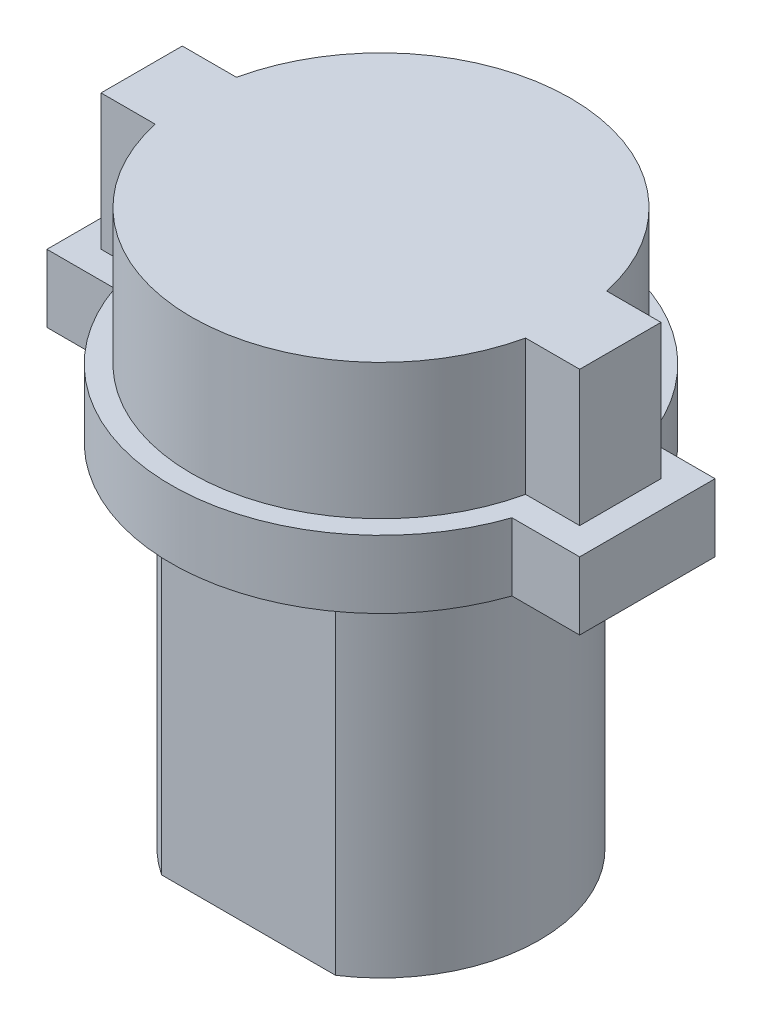
ISO-10303-21;
HEADER;
FILE_DESCRIPTION(('STEP AP214'),'2;1');
FILE_NAME('part.step','',(''),(''),'','','');
FILE_SCHEMA(('AUTOMOTIVE_DESIGN { 1 0 10303 214 1 1 1 1 }'));
ENDSEC;
DATA;
#1=APPLICATION_CONTEXT('core data for automotive mechanical design processes');
#2=APPLICATION_PROTOCOL_DEFINITION('international standard','automotive_design',2000,#1);
#3=PRODUCT_CONTEXT('',#1,'mechanical');
#4=PRODUCT('Part','Part','',(#3));
#5=PRODUCT_RELATED_PRODUCT_CATEGORY('part','',(#4));
#6=PRODUCT_DEFINITION_FORMATION('','',#4);
#7=PRODUCT_DEFINITION_CONTEXT('part definition',#1,'design');
#8=PRODUCT_DEFINITION('design','',#6,#7);
#9=PRODUCT_DEFINITION_SHAPE('','',#8);
#10=(LENGTH_UNIT() NAMED_UNIT(*) SI_UNIT(.MILLI.,.METRE.));
#11=(NAMED_UNIT(*) PLANE_ANGLE_UNIT() SI_UNIT($,.RADIAN.));
#12=(NAMED_UNIT(*) SI_UNIT($,.STERADIAN.) SOLID_ANGLE_UNIT());
#13=UNCERTAINTY_MEASURE_WITH_UNIT(LENGTH_MEASURE(1.E-05),#10,'distance_accuracy_value','');
#14=(GEOMETRIC_REPRESENTATION_CONTEXT(3) GLOBAL_UNCERTAINTY_ASSIGNED_CONTEXT((#13)) GLOBAL_UNIT_ASSIGNED_CONTEXT((#10,
#11,#12)) REPRESENTATION_CONTEXT('',''));
#15=CARTESIAN_POINT('',(0.,0.,0.));
#16=DIRECTION('',(0.,0.,1.));
#17=DIRECTION('',(1.,0.,0.));
#18=AXIS2_PLACEMENT_3D('',#15,#16,#17);
#19=CARTESIAN_POINT('',(0.,13.,0.));
#20=DIRECTION('',(0.,-1.,0.));
#21=DIRECTION('',(0.,0.,-1.));
#22=AXIS2_PLACEMENT_3D('',#19,#20,#21);
#23=CYLINDRICAL_SURFACE('',#22,5.85);
#24=CARTESIAN_POINT('',(0.,0.,0.));
#25=DIRECTION('',(0.,1.,0.));
#26=DIRECTION('',(0.,0.,1.));
#27=AXIS2_PLACEMENT_3D('',#24,#25,#26);
#28=CIRCLE('',#27,5.85);
#29=CARTESIAN_POINT('',(-3.21098115846232,0.,-4.89));
#30=VERTEX_POINT('',#29);
#31=CARTESIAN_POINT('',(-3.21098115846232,0.,4.89));
#32=VERTEX_POINT('',#31);
#33=EDGE_CURVE('E298',#30,#32,#28,.T.);
#34=ORIENTED_EDGE('',*,*,#33,.T.);
#35=DIRECTION('',(0.,-1.,0.));
#36=VECTOR('',#35,1.);
#37=CARTESIAN_POINT('',(-3.21098115846232,13.,4.89));
#38=LINE('',#37,#36);
#39=CARTESIAN_POINT('',(-3.21098115846232,13.,4.89));
#40=VERTEX_POINT('',#39);
#41=EDGE_CURVE('E11',#40,#32,#38,.T.);
#42=ORIENTED_EDGE('',*,*,#41,.F.);
#43=CARTESIAN_POINT('',(0.,13.,0.));
#44=DIRECTION('',(0.,1.,0.));
#45=DIRECTION('',(0.,0.,1.));
#46=AXIS2_PLACEMENT_3D('',#43,#44,#45);
#47=CIRCLE('',#46,5.85);
#48=CARTESIAN_POINT('',(-3.21098115846232,13.,-4.89));
#49=VERTEX_POINT('',#48);
#50=EDGE_CURVE('E299',#49,#40,#47,.T.);
#51=ORIENTED_EDGE('',*,*,#50,.F.);
#52=DIRECTION('',(0.,-1.,0.));
#53=VECTOR('',#52,1.);
#54=CARTESIAN_POINT('',(-3.21098115846232,13.,-4.89));
#55=LINE('',#54,#53);
#56=EDGE_CURVE('E313',#49,#30,#55,.T.);
#57=ORIENTED_EDGE('',*,*,#56,.T.);
#58=EDGE_LOOP('',(#34,#42,#51,#57));
#59=FACE_BOUND('',#58,.T.);
#60=ADVANCED_FACE('F47',(#59),#23,.T.);
#61=CARTESIAN_POINT('',(0.,13.,4.89));
#62=DIRECTION('',(0.,0.,1.));
#63=DIRECTION('',(1.,0.,0.));
#64=AXIS2_PLACEMENT_3D('',#61,#62,#63);
#65=PLANE('',#64);
#66=DIRECTION('',(-1.,0.,0.));
#67=VECTOR('',#66,1.);
#68=CARTESIAN_POINT('',(0.,0.,4.89));
#69=LINE('',#68,#67);
#70=CARTESIAN_POINT('',(3.21098115846232,0.,4.89));
#71=VERTEX_POINT('',#70);
#72=EDGE_CURVE('E317',#71,#32,#69,.T.);
#73=ORIENTED_EDGE('',*,*,#72,.F.);
#74=DIRECTION('',(0.,-1.,0.));
#75=VECTOR('',#74,1.);
#76=CARTESIAN_POINT('',(3.21098115846232,13.,4.89));
#77=LINE('',#76,#75);
#78=CARTESIAN_POINT('',(3.21098115846232,13.,4.89));
#79=VERTEX_POINT('',#78);
#80=EDGE_CURVE('E56',#79,#71,#77,.T.);
#81=ORIENTED_EDGE('',*,*,#80,.F.);
#82=DIRECTION('',(-1.,0.,0.));
#83=VECTOR('',#82,1.);
#84=CARTESIAN_POINT('',(0.,13.,4.89));
#85=LINE('',#84,#83);
#86=EDGE_CURVE('E303',#79,#40,#85,.T.);
#87=ORIENTED_EDGE('',*,*,#86,.T.);
#88=ORIENTED_EDGE('',*,*,#41,.T.);
#89=EDGE_LOOP('',(#73,#81,#87,#88));
#90=FACE_BOUND('',#89,.T.);
#91=ADVANCED_FACE('F49',(#90),#65,.T.);
#92=CARTESIAN_POINT('',(3.21098115846232,0.,-4.89));
#93=VERTEX_POINT('',#92);
#94=EDGE_CURVE('E318',#71,#93,#28,.T.);
#95=ORIENTED_EDGE('',*,*,#94,.T.);
#96=DIRECTION('',(0.,-1.,0.));
#97=VECTOR('',#96,1.);
#98=CARTESIAN_POINT('',(3.21098115846232,13.,-4.89));
#99=LINE('',#98,#97);
#100=CARTESIAN_POINT('',(3.21098115846232,13.,-4.89));
#101=VERTEX_POINT('',#100);
#102=EDGE_CURVE('E327',#101,#93,#99,.T.);
#103=ORIENTED_EDGE('',*,*,#102,.F.);
#104=EDGE_CURVE('E305',#79,#101,#47,.T.);
#105=ORIENTED_EDGE('',*,*,#104,.F.);
#106=ORIENTED_EDGE('',*,*,#80,.T.);
#107=EDGE_LOOP('',(#95,#103,#105,#106));
#108=FACE_BOUND('',#107,.T.);
#109=ADVANCED_FACE('F334',(#108),#23,.T.);
#110=CARTESIAN_POINT('',(0.,13.,-4.89));
#111=DIRECTION('',(0.,0.,1.));
#112=DIRECTION('',(1.,0.,0.));
#113=AXIS2_PLACEMENT_3D('',#110,#111,#112);
#114=PLANE('',#113);
#115=DIRECTION('',(-1.,0.,0.));
#116=VECTOR('',#115,1.);
#117=CARTESIAN_POINT('',(0.,0.,-4.89));
#118=LINE('',#117,#116);
#119=EDGE_CURVE('E304',#93,#30,#118,.T.);
#120=ORIENTED_EDGE('',*,*,#119,.T.);
#121=ORIENTED_EDGE('',*,*,#56,.F.);
#122=DIRECTION('',(-1.,0.,0.));
#123=VECTOR('',#122,1.);
#124=CARTESIAN_POINT('',(0.,13.,-4.89));
#125=LINE('',#124,#123);
#126=EDGE_CURVE('E309',#101,#49,#125,.T.);
#127=ORIENTED_EDGE('',*,*,#126,.F.);
#128=ORIENTED_EDGE('',*,*,#102,.T.);
#129=EDGE_LOOP('',(#120,#121,#127,#128));
#130=FACE_BOUND('',#129,.T.);
#131=ADVANCED_FACE('F348',(#130),#114,.F.);
#132=CARTESIAN_POINT('',(0.,0.,0.));
#133=DIRECTION('',(0.,1.,0.));
#134=DIRECTION('',(0.,0.,1.));
#135=AXIS2_PLACEMENT_3D('',#132,#133,#134);
#136=PLANE('',#135);
#137=ORIENTED_EDGE('',*,*,#33,.F.);
#138=ORIENTED_EDGE('',*,*,#119,.F.);
#139=ORIENTED_EDGE('',*,*,#94,.F.);
#140=ORIENTED_EDGE('',*,*,#72,.T.);
#141=EDGE_LOOP('',(#137,#138,#139,#140));
#142=FACE_BOUND('',#141,.T.);
#143=ADVANCED_FACE('F342',(#142),#136,.F.);
#144=CARTESIAN_POINT('',(0.,13.,0.));
#145=DIRECTION('',(0.,1.,0.));
#146=DIRECTION('',(0.,0.,1.));
#147=AXIS2_PLACEMENT_3D('',#144,#145,#146);
#148=PLANE('',#147);
#149=DIRECTION('',(-1.,0.,0.));
#150=VECTOR('',#149,1.);
#151=CARTESIAN_POINT('',(0.,13.,2.50000000000006));
#152=LINE('',#151,#150);
#153=CARTESIAN_POINT('',(-7.33570037556058,13.,2.50000000000006));
#154=VERTEX_POINT('',#153);
#155=CARTESIAN_POINT('',(-9.83570037556071,13.,2.50000000000006));
#156=VERTEX_POINT('',#155);
#157=EDGE_CURVE('E209',#154,#156,#152,.T.);
#158=ORIENTED_EDGE('',*,*,#157,.T.);
#159=DIRECTION('',(0.,0.,-1.));
#160=VECTOR('',#159,1.);
#161=CARTESIAN_POINT('',(-9.83570037556071,13.,0.));
#162=LINE('',#161,#160);
#163=CARTESIAN_POINT('',(-9.83570037556071,13.,-2.50000000000006));
#164=VERTEX_POINT('',#163);
#165=EDGE_CURVE('E225',#156,#164,#162,.T.);
#166=ORIENTED_EDGE('',*,*,#165,.T.);
#167=DIRECTION('',(1.,0.,0.));
#168=VECTOR('',#167,1.);
#169=CARTESIAN_POINT('',(0.,13.,-2.50000000000006));
#170=LINE('',#169,#168);
#171=CARTESIAN_POINT('',(-7.33570037556058,13.,-2.50000000000006));
#172=VERTEX_POINT('',#171);
#173=EDGE_CURVE('E264',#164,#172,#170,.T.);
#174=ORIENTED_EDGE('',*,*,#173,.T.);
#175=CARTESIAN_POINT('',(0.,13.,0.));
#176=DIRECTION('',(0.,1.,0.));
#177=DIRECTION('',(0.,0.,1.));
#178=AXIS2_PLACEMENT_3D('',#175,#176,#177);
#179=CIRCLE('',#178,7.75);
#180=CARTESIAN_POINT('',(7.33570037556058,13.,-2.50000000000006));
#181=VERTEX_POINT('',#180);
#182=EDGE_CURVE('E260',#181,#172,#179,.T.);
#183=ORIENTED_EDGE('',*,*,#182,.F.);
#184=DIRECTION('',(-1.,0.,0.));
#185=VECTOR('',#184,1.);
#186=CARTESIAN_POINT('',(0.,13.,-2.50000000000006));
#187=LINE('',#186,#185);
#188=CARTESIAN_POINT('',(9.83570037556071,13.,-2.50000000000006));
#189=VERTEX_POINT('',#188);
#190=EDGE_CURVE('E257',#189,#181,#187,.T.);
#191=ORIENTED_EDGE('',*,*,#190,.F.);
#192=DIRECTION('',(0.,0.,-1.));
#193=VECTOR('',#192,1.);
#194=CARTESIAN_POINT('',(9.83570037556071,13.,0.));
#195=LINE('',#194,#193);
#196=CARTESIAN_POINT('',(9.83570037556071,13.,2.50000000000006));
#197=VERTEX_POINT('',#196);
#198=EDGE_CURVE('E254',#197,#189,#195,.T.);
#199=ORIENTED_EDGE('',*,*,#198,.F.);
#200=DIRECTION('',(1.,0.,0.));
#201=VECTOR('',#200,1.);
#202=CARTESIAN_POINT('',(0.,13.,2.50000000000006));
#203=LINE('',#202,#201);
#204=CARTESIAN_POINT('',(7.33570037556058,13.,2.50000000000006));
#205=VERTEX_POINT('',#204);
#206=EDGE_CURVE('E251',#205,#197,#203,.T.);
#207=ORIENTED_EDGE('',*,*,#206,.F.);
#208=CARTESIAN_POINT('',(0.,13.,0.));
#209=DIRECTION('',(0.,1.,0.));
#210=DIRECTION('',(0.,0.,1.));
#211=AXIS2_PLACEMENT_3D('',#208,#209,#210);
#212=CIRCLE('',#211,7.75);
#213=EDGE_CURVE('E214',#154,#205,#212,.T.);
#214=ORIENTED_EDGE('',*,*,#213,.F.);
#215=EDGE_LOOP('',(#158,#166,#174,#183,#191,#199,#207,#214));
#216=FACE_BOUND('',#215,.T.);
#217=ORIENTED_EDGE('',*,*,#126,.T.);
#218=ORIENTED_EDGE('',*,*,#50,.T.);
#219=ORIENTED_EDGE('',*,*,#86,.F.);
#220=ORIENTED_EDGE('',*,*,#104,.T.);
#221=EDGE_LOOP('',(#217,#218,#219,#220));
#222=FACE_BOUND('',#221,.T.);
#223=ADVANCED_FACE('F350',(#216,#222),#148,.F.);
#224=CARTESIAN_POINT('',(0.,15.5,2.50000000000006));
#225=DIRECTION('',(0.,0.,1.));
#226=DIRECTION('',(1.,0.,0.));
#227=AXIS2_PLACEMENT_3D('',#224,#225,#226);
#228=PLANE('',#227);
#229=ORIENTED_EDGE('',*,*,#157,.F.);
#230=DIRECTION('',(0.,-1.,0.));
#231=VECTOR('',#230,1.);
#232=CARTESIAN_POINT('',(-7.33570037556058,15.5,2.50000000000006));
#233=LINE('',#232,#231);
#234=CARTESIAN_POINT('',(-7.33570037556058,15.5,2.50000000000006));
#235=VERTEX_POINT('',#234);
#236=EDGE_CURVE('E295',#235,#154,#233,.T.);
#237=ORIENTED_EDGE('',*,*,#236,.F.);
#238=DIRECTION('',(-1.,0.,0.));
#239=VECTOR('',#238,1.);
#240=CARTESIAN_POINT('',(0.,15.5,2.50000000000006));
#241=LINE('',#240,#239);
#242=CARTESIAN_POINT('',(-9.83570037556071,15.5,2.50000000000006));
#243=VERTEX_POINT('',#242);
#244=EDGE_CURVE('E220',#235,#243,#241,.T.);
#245=ORIENTED_EDGE('',*,*,#244,.T.);
#246=DIRECTION('',(0.,-1.,0.));
#247=VECTOR('',#246,1.);
#248=CARTESIAN_POINT('',(-9.83570037556071,15.5,2.50000000000006));
#249=LINE('',#248,#247);
#250=EDGE_CURVE('E247',#243,#156,#249,.T.);
#251=ORIENTED_EDGE('',*,*,#250,.T.);
#252=EDGE_LOOP('',(#229,#237,#245,#251));
#253=FACE_BOUND('',#252,.T.);
#254=ADVANCED_FACE('F353',(#253),#228,.T.);
#255=CARTESIAN_POINT('',(0.,15.5,0.));
#256=DIRECTION('',(0.,-1.,0.));
#257=DIRECTION('',(0.,0.,-1.));
#258=AXIS2_PLACEMENT_3D('',#255,#256,#257);
#259=CYLINDRICAL_SURFACE('',#258,7.75);
#260=ORIENTED_EDGE('',*,*,#213,.T.);
#261=DIRECTION('',(0.,-1.,0.));
#262=VECTOR('',#261,1.);
#263=CARTESIAN_POINT('',(7.33570037556058,15.5,2.50000000000006));
#264=LINE('',#263,#262);
#265=CARTESIAN_POINT('',(7.33570037556058,15.5,2.50000000000006));
#266=VERTEX_POINT('',#265);
#267=EDGE_CURVE('E291',#266,#205,#264,.T.);
#268=ORIENTED_EDGE('',*,*,#267,.F.);
#269=CARTESIAN_POINT('',(0.,15.5,0.));
#270=DIRECTION('',(0.,1.,0.));
#271=DIRECTION('',(0.,0.,1.));
#272=AXIS2_PLACEMENT_3D('',#269,#270,#271);
#273=CIRCLE('',#272,7.75);
#274=EDGE_CURVE('E224',#235,#266,#273,.T.);
#275=ORIENTED_EDGE('',*,*,#274,.F.);
#276=ORIENTED_EDGE('',*,*,#236,.T.);
#277=EDGE_LOOP('',(#260,#268,#275,#276));
#278=FACE_BOUND('',#277,.T.);
#279=ADVANCED_FACE('F360',(#278),#259,.T.);
#280=CARTESIAN_POINT('',(0.,15.5,2.50000000000006));
#281=DIRECTION('',(0.,0.,-1.));
#282=DIRECTION('',(-1.,0.,0.));
#283=AXIS2_PLACEMENT_3D('',#280,#281,#282);
#284=PLANE('',#283);
#285=ORIENTED_EDGE('',*,*,#206,.T.);
#286=DIRECTION('',(0.,-1.,0.));
#287=VECTOR('',#286,1.);
#288=CARTESIAN_POINT('',(9.83570037556071,15.5,2.50000000000006));
#289=LINE('',#288,#287);
#290=CARTESIAN_POINT('',(9.83570037556071,15.5,2.50000000000006));
#291=VERTEX_POINT('',#290);
#292=EDGE_CURVE('E287',#291,#197,#289,.T.);
#293=ORIENTED_EDGE('',*,*,#292,.F.);
#294=DIRECTION('',(1.,0.,0.));
#295=VECTOR('',#294,1.);
#296=CARTESIAN_POINT('',(0.,15.5,2.50000000000006));
#297=LINE('',#296,#295);
#298=EDGE_CURVE('E228',#266,#291,#297,.T.);
#299=ORIENTED_EDGE('',*,*,#298,.F.);
#300=ORIENTED_EDGE('',*,*,#267,.T.);
#301=EDGE_LOOP('',(#285,#293,#299,#300));
#302=FACE_BOUND('',#301,.T.);
#303=ADVANCED_FACE('F380',(#302),#284,.F.);
#304=CARTESIAN_POINT('',(9.83570037556071,15.5,0.));
#305=DIRECTION('',(-1.,0.,0.));
#306=DIRECTION('',(0.,0.,1.));
#307=AXIS2_PLACEMENT_3D('',#304,#305,#306);
#308=PLANE('',#307);
#309=ORIENTED_EDGE('',*,*,#198,.T.);
#310=DIRECTION('',(0.,-1.,0.));
#311=VECTOR('',#310,1.);
#312=CARTESIAN_POINT('',(9.83570037556071,15.5,-2.50000000000006));
#313=LINE('',#312,#311);
#314=CARTESIAN_POINT('',(9.83570037556071,15.5,-2.50000000000006));
#315=VERTEX_POINT('',#314);
#316=EDGE_CURVE('E283',#315,#189,#313,.T.);
#317=ORIENTED_EDGE('',*,*,#316,.F.);
#318=DIRECTION('',(0.,0.,-1.));
#319=VECTOR('',#318,1.);
#320=CARTESIAN_POINT('',(9.83570037556071,15.5,0.));
#321=LINE('',#320,#319);
#322=EDGE_CURVE('E231',#291,#315,#321,.T.);
#323=ORIENTED_EDGE('',*,*,#322,.F.);
#324=ORIENTED_EDGE('',*,*,#292,.T.);
#325=EDGE_LOOP('',(#309,#317,#323,#324));
#326=FACE_BOUND('',#325,.T.);
#327=ADVANCED_FACE('F384',(#326),#308,.F.);
#328=CARTESIAN_POINT('',(0.,15.5,-2.50000000000006));
#329=DIRECTION('',(0.,0.,1.));
#330=DIRECTION('',(1.,0.,0.));
#331=AXIS2_PLACEMENT_3D('',#328,#329,#330);
#332=PLANE('',#331);
#333=ORIENTED_EDGE('',*,*,#190,.T.);
#334=DIRECTION('',(0.,-1.,0.));
#335=VECTOR('',#334,1.);
#336=CARTESIAN_POINT('',(7.33570037556058,15.5,-2.50000000000006));
#337=LINE('',#336,#335);
#338=CARTESIAN_POINT('',(7.33570037556058,15.5,-2.50000000000006));
#339=VERTEX_POINT('',#338);
#340=EDGE_CURVE('E279',#339,#181,#337,.T.);
#341=ORIENTED_EDGE('',*,*,#340,.F.);
#342=DIRECTION('',(-1.,0.,0.));
#343=VECTOR('',#342,1.);
#344=CARTESIAN_POINT('',(0.,15.5,-2.50000000000006));
#345=LINE('',#344,#343);
#346=EDGE_CURVE('E234',#315,#339,#345,.T.);
#347=ORIENTED_EDGE('',*,*,#346,.F.);
#348=ORIENTED_EDGE('',*,*,#316,.T.);
#349=EDGE_LOOP('',(#333,#341,#347,#348));
#350=FACE_BOUND('',#349,.T.);
#351=ADVANCED_FACE('F388',(#350),#332,.F.);
#352=CARTESIAN_POINT('',(0.,15.5,0.));
#353=DIRECTION('',(0.,-1.,0.));
#354=DIRECTION('',(0.,0.,-1.));
#355=AXIS2_PLACEMENT_3D('',#352,#353,#354);
#356=CYLINDRICAL_SURFACE('',#355,7.75);
#357=ORIENTED_EDGE('',*,*,#182,.T.);
#358=DIRECTION('',(0.,-1.,0.));
#359=VECTOR('',#358,1.);
#360=CARTESIAN_POINT('',(-7.33570037556058,15.5,-2.50000000000006));
#361=LINE('',#360,#359);
#362=CARTESIAN_POINT('',(-7.33570037556058,15.5,-2.50000000000006));
#363=VERTEX_POINT('',#362);
#364=EDGE_CURVE('E276',#363,#172,#361,.T.);
#365=ORIENTED_EDGE('',*,*,#364,.F.);
#366=CARTESIAN_POINT('',(0.,15.5,0.));
#367=DIRECTION('',(0.,1.,0.));
#368=DIRECTION('',(0.,0.,1.));
#369=AXIS2_PLACEMENT_3D('',#366,#367,#368);
#370=CIRCLE('',#369,7.75);
#371=EDGE_CURVE('E237',#339,#363,#370,.T.);
#372=ORIENTED_EDGE('',*,*,#371,.F.);
#373=ORIENTED_EDGE('',*,*,#340,.T.);
#374=EDGE_LOOP('',(#357,#365,#372,#373));
#375=FACE_BOUND('',#374,.T.);
#376=ADVANCED_FACE('F392',(#375),#356,.T.);
#377=CARTESIAN_POINT('',(0.,15.5,-2.50000000000006));
#378=DIRECTION('',(0.,0.,-1.));
#379=DIRECTION('',(-1.,0.,0.));
#380=AXIS2_PLACEMENT_3D('',#377,#378,#379);
#381=PLANE('',#380);
#382=ORIENTED_EDGE('',*,*,#173,.F.);
#383=DIRECTION('',(0.,-1.,0.));
#384=VECTOR('',#383,1.);
#385=CARTESIAN_POINT('',(-9.83570037556071,15.5,-2.50000000000006));
#386=LINE('',#385,#384);
#387=CARTESIAN_POINT('',(-9.83570037556071,15.5,-2.50000000000006));
#388=VERTEX_POINT('',#387);
#389=EDGE_CURVE('E273',#388,#164,#386,.T.);
#390=ORIENTED_EDGE('',*,*,#389,.F.);
#391=DIRECTION('',(1.,0.,0.));
#392=VECTOR('',#391,1.);
#393=CARTESIAN_POINT('',(0.,15.5,-2.50000000000006));
#394=LINE('',#393,#392);
#395=EDGE_CURVE('E240',#388,#363,#394,.T.);
#396=ORIENTED_EDGE('',*,*,#395,.T.);
#397=ORIENTED_EDGE('',*,*,#364,.T.);
#398=EDGE_LOOP('',(#382,#390,#396,#397));
#399=FACE_BOUND('',#398,.T.);
#400=ADVANCED_FACE('F396',(#399),#381,.T.);
#401=CARTESIAN_POINT('',(-9.83570037556071,15.5,0.));
#402=DIRECTION('',(-1.,0.,0.));
#403=DIRECTION('',(0.,0.,1.));
#404=AXIS2_PLACEMENT_3D('',#401,#402,#403);
#405=PLANE('',#404);
#406=ORIENTED_EDGE('',*,*,#165,.F.);
#407=ORIENTED_EDGE('',*,*,#250,.F.);
#408=DIRECTION('',(0.,0.,-1.));
#409=VECTOR('',#408,1.);
#410=CARTESIAN_POINT('',(-9.83570037556071,15.5,0.));
#411=LINE('',#410,#409);
#412=EDGE_CURVE('E244',#243,#388,#411,.T.);
#413=ORIENTED_EDGE('',*,*,#412,.T.);
#414=ORIENTED_EDGE('',*,*,#389,.T.);
#415=EDGE_LOOP('',(#406,#407,#413,#414));
#416=FACE_BOUND('',#415,.T.);
#417=ADVANCED_FACE('F399',(#416),#405,.T.);
#418=CARTESIAN_POINT('',(0.,15.5,0.));
#419=DIRECTION('',(0.,1.,0.));
#420=DIRECTION('',(0.,0.,1.));
#421=AXIS2_PLACEMENT_3D('',#418,#419,#420);
#422=PLANE('',#421);
#423=CARTESIAN_POINT('',(0.,15.5,0.));
#424=DIRECTION('',(0.,1.,0.));
#425=DIRECTION('',(0.,0.,1.));
#426=AXIS2_PLACEMENT_3D('',#423,#424,#425);
#427=CIRCLE('',#426,7.);
#428=CARTESIAN_POINT('',(-6.83739716558867,15.5,1.50000000000003));
#429=VERTEX_POINT('',#428);
#430=CARTESIAN_POINT('',(6.83739716558868,15.5,1.49999999999997));
#431=VERTEX_POINT('',#430);
#432=EDGE_CURVE('E63',#429,#431,#427,.T.);
#433=ORIENTED_EDGE('',*,*,#432,.F.);
#434=DIRECTION('',(-1.,0.,0.));
#435=VECTOR('',#434,1.);
#436=CARTESIAN_POINT('',(0.,15.5,1.5));
#437=LINE('',#436,#435);
#438=CARTESIAN_POINT('',(-8.83739716558867,15.5,1.50000000000004));
#439=VERTEX_POINT('',#438);
#440=EDGE_CURVE('E68',#429,#439,#437,.T.);
#441=ORIENTED_EDGE('',*,*,#440,.T.);
#442=DIRECTION('',(0.,0.,-1.));
#443=VECTOR('',#442,1.);
#444=CARTESIAN_POINT('',(-8.83739716558867,15.5,0.));
#445=LINE('',#444,#443);
#446=CARTESIAN_POINT('',(-8.83739716558868,15.5,-1.49999999999996));
#447=VERTEX_POINT('',#446);
#448=EDGE_CURVE('E632',#439,#447,#445,.T.);
#449=ORIENTED_EDGE('',*,*,#448,.T.);
#450=DIRECTION('',(1.,0.,0.));
#451=VECTOR('',#450,1.);
#452=CARTESIAN_POINT('',(0.,15.5,-1.5));
#453=LINE('',#452,#451);
#454=CARTESIAN_POINT('',(-6.83739716558868,15.5,-1.49999999999997));
#455=VERTEX_POINT('',#454);
#456=EDGE_CURVE('E635',#447,#455,#453,.T.);
#457=ORIENTED_EDGE('',*,*,#456,.T.);
#458=CARTESIAN_POINT('',(6.83739716558867,15.5,-1.50000000000003));
#459=VERTEX_POINT('',#458);
#460=EDGE_CURVE('E669',#459,#455,#427,.T.);
#461=ORIENTED_EDGE('',*,*,#460,.F.);
#462=DIRECTION('',(-1.,0.,0.));
#463=VECTOR('',#462,1.);
#464=CARTESIAN_POINT('',(0.,15.5,-1.5));
#465=LINE('',#464,#463);
#466=CARTESIAN_POINT('',(8.83739716558867,15.5,-1.50000000000004));
#467=VERTEX_POINT('',#466);
#468=EDGE_CURVE('E660',#467,#459,#465,.T.);
#469=ORIENTED_EDGE('',*,*,#468,.F.);
#470=DIRECTION('',(0.,0.,-1.));
#471=VECTOR('',#470,1.);
#472=CARTESIAN_POINT('',(8.83739716558867,15.5,0.));
#473=LINE('',#472,#471);
#474=CARTESIAN_POINT('',(8.83739716558868,15.5,1.49999999999996));
#475=VERTEX_POINT('',#474);
#476=EDGE_CURVE('E663',#475,#467,#473,.T.);
#477=ORIENTED_EDGE('',*,*,#476,.F.);
#478=DIRECTION('',(1.,0.,0.));
#479=VECTOR('',#478,1.);
#480=CARTESIAN_POINT('',(0.,15.5,1.5));
#481=LINE('',#480,#479);
#482=EDGE_CURVE('E665',#431,#475,#481,.T.);
#483=ORIENTED_EDGE('',*,*,#482,.F.);
#484=EDGE_LOOP('',(#433,#441,#449,#457,#461,#469,#477,#483));
#485=FACE_BOUND('',#484,.T.);
#486=ORIENTED_EDGE('',*,*,#244,.F.);
#487=ORIENTED_EDGE('',*,*,#274,.T.);
#488=ORIENTED_EDGE('',*,*,#298,.T.);
#489=ORIENTED_EDGE('',*,*,#322,.T.);
#490=ORIENTED_EDGE('',*,*,#346,.T.);
#491=ORIENTED_EDGE('',*,*,#371,.T.);
#492=ORIENTED_EDGE('',*,*,#395,.F.);
#493=ORIENTED_EDGE('',*,*,#412,.F.);
#494=EDGE_LOOP('',(#486,#487,#488,#489,#490,#491,#492,#493));
#495=FACE_BOUND('',#494,.T.);
#496=ADVANCED_FACE('F402',(#485,#495),#422,.T.);
#497=CARTESIAN_POINT('',(0.,20.5,0.));
#498=DIRECTION('',(0.,-1.,0.));
#499=DIRECTION('',(0.,0.,-1.));
#500=AXIS2_PLACEMENT_3D('',#497,#498,#499);
#501=CYLINDRICAL_SURFACE('',#500,7.);
#502=ORIENTED_EDGE('',*,*,#432,.T.);
#503=DIRECTION('',(0.,-1.,0.));
#504=VECTOR('',#503,1.);
#505=CARTESIAN_POINT('',(6.83739716558868,20.5,1.49999999999997));
#506=LINE('',#505,#504);
#507=CARTESIAN_POINT('',(6.83739716558868,20.5,1.49999999999997));
#508=VERTEX_POINT('',#507);
#509=EDGE_CURVE('E188',#508,#431,#506,.T.);
#510=ORIENTED_EDGE('',*,*,#509,.F.);
#511=CARTESIAN_POINT('',(0.,20.5,0.));
#512=DIRECTION('',(0.,1.,0.));
#513=DIRECTION('',(0.,0.,1.));
#514=AXIS2_PLACEMENT_3D('',#511,#512,#513);
#515=CIRCLE('',#514,7.);
#516=CARTESIAN_POINT('',(-6.83739716558867,20.5,1.50000000000003));
#517=VERTEX_POINT('',#516);
#518=EDGE_CURVE('E195',#517,#508,#515,.T.);
#519=ORIENTED_EDGE('',*,*,#518,.F.);
#520=DIRECTION('',(0.,-1.,0.));
#521=VECTOR('',#520,1.);
#522=CARTESIAN_POINT('',(-6.83739716558867,20.5,1.50000000000003));
#523=LINE('',#522,#521);
#524=EDGE_CURVE('E628',#517,#429,#523,.T.);
#525=ORIENTED_EDGE('',*,*,#524,.T.);
#526=EDGE_LOOP('',(#502,#510,#519,#525));
#527=FACE_BOUND('',#526,.T.);
#528=ADVANCED_FACE('F207',(#527),#501,.T.);
#529=CARTESIAN_POINT('',(0.,20.5,1.5));
#530=DIRECTION('',(0.,0.,-1.));
#531=DIRECTION('',(-1.,0.,0.));
#532=AXIS2_PLACEMENT_3D('',#529,#530,#531);
#533=PLANE('',#532);
#534=ORIENTED_EDGE('',*,*,#482,.T.);
#535=DIRECTION('',(0.,-1.,0.));
#536=VECTOR('',#535,1.);
#537=CARTESIAN_POINT('',(8.83739716558868,20.5,1.49999999999996));
#538=LINE('',#537,#536);
#539=CARTESIAN_POINT('',(8.83739716558868,20.5,1.49999999999996));
#540=VERTEX_POINT('',#539);
#541=EDGE_CURVE('E190',#540,#475,#538,.T.);
#542=ORIENTED_EDGE('',*,*,#541,.F.);
#543=DIRECTION('',(1.,0.,0.));
#544=VECTOR('',#543,1.);
#545=CARTESIAN_POINT('',(0.,20.5,1.5));
#546=LINE('',#545,#544);
#547=EDGE_CURVE('E183',#508,#540,#546,.T.);
#548=ORIENTED_EDGE('',*,*,#547,.F.);
#549=ORIENTED_EDGE('',*,*,#509,.T.);
#550=EDGE_LOOP('',(#534,#542,#548,#549));
#551=FACE_BOUND('',#550,.T.);
#552=ADVANCED_FACE('F186',(#551),#533,.F.);
#553=CARTESIAN_POINT('',(8.83739716558867,20.5,0.));
#554=DIRECTION('',(-1.,0.,0.));
#555=DIRECTION('',(0.,0.,1.));
#556=AXIS2_PLACEMENT_3D('',#553,#554,#555);
#557=PLANE('',#556);
#558=ORIENTED_EDGE('',*,*,#476,.T.);
#559=DIRECTION('',(0.,-1.,0.));
#560=VECTOR('',#559,1.);
#561=CARTESIAN_POINT('',(8.83739716558867,20.5,-1.50000000000004));
#562=LINE('',#561,#560);
#563=CARTESIAN_POINT('',(8.83739716558867,20.5,-1.50000000000004));
#564=VERTEX_POINT('',#563);
#565=EDGE_CURVE('E216',#564,#467,#562,.T.);
#566=ORIENTED_EDGE('',*,*,#565,.F.);
#567=DIRECTION('',(0.,0.,-1.));
#568=VECTOR('',#567,1.);
#569=CARTESIAN_POINT('',(8.83739716558867,20.5,0.));
#570=LINE('',#569,#568);
#571=EDGE_CURVE('E194',#540,#564,#570,.T.);
#572=ORIENTED_EDGE('',*,*,#571,.F.);
#573=ORIENTED_EDGE('',*,*,#541,.T.);
#574=EDGE_LOOP('',(#558,#566,#572,#573));
#575=FACE_BOUND('',#574,.T.);
#576=ADVANCED_FACE('F437',(#575),#557,.F.);
#577=CARTESIAN_POINT('',(0.,20.5,-1.5));
#578=DIRECTION('',(0.,0.,1.));
#579=DIRECTION('',(1.,0.,0.));
#580=AXIS2_PLACEMENT_3D('',#577,#578,#579);
#581=PLANE('',#580);
#582=ORIENTED_EDGE('',*,*,#468,.T.);
#583=DIRECTION('',(0.,-1.,0.));
#584=VECTOR('',#583,1.);
#585=CARTESIAN_POINT('',(6.83739716558867,20.5,-1.50000000000003));
#586=LINE('',#585,#584);
#587=CARTESIAN_POINT('',(6.83739716558867,20.5,-1.50000000000003));
#588=VERTEX_POINT('',#587);
#589=EDGE_CURVE('E651',#588,#459,#586,.T.);
#590=ORIENTED_EDGE('',*,*,#589,.F.);
#591=DIRECTION('',(-1.,0.,0.));
#592=VECTOR('',#591,1.);
#593=CARTESIAN_POINT('',(0.,20.5,-1.5));
#594=LINE('',#593,#592);
#595=EDGE_CURVE('E661',#564,#588,#594,.T.);
#596=ORIENTED_EDGE('',*,*,#595,.F.);
#597=ORIENTED_EDGE('',*,*,#565,.T.);
#598=EDGE_LOOP('',(#582,#590,#596,#597));
#599=FACE_BOUND('',#598,.T.);
#600=ADVANCED_FACE('F440',(#599),#581,.F.);
#601=ORIENTED_EDGE('',*,*,#460,.T.);
#602=DIRECTION('',(0.,-1.,0.));
#603=VECTOR('',#602,1.);
#604=CARTESIAN_POINT('',(-6.83739716558868,20.5,-1.49999999999997));
#605=LINE('',#604,#603);
#606=CARTESIAN_POINT('',(-6.83739716558868,20.5,-1.49999999999997));
#607=VERTEX_POINT('',#606);
#608=EDGE_CURVE('E647',#607,#455,#605,.T.);
#609=ORIENTED_EDGE('',*,*,#608,.F.);
#610=EDGE_CURVE('E206',#588,#607,#515,.T.);
#611=ORIENTED_EDGE('',*,*,#610,.F.);
#612=ORIENTED_EDGE('',*,*,#589,.T.);
#613=EDGE_LOOP('',(#601,#609,#611,#612));
#614=FACE_BOUND('',#613,.T.);
#615=ADVANCED_FACE('F433',(#614),#501,.T.);
#616=CARTESIAN_POINT('',(0.,20.5,-1.5));
#617=DIRECTION('',(0.,0.,-1.));
#618=DIRECTION('',(-1.,0.,0.));
#619=AXIS2_PLACEMENT_3D('',#616,#617,#618);
#620=PLANE('',#619);
#621=ORIENTED_EDGE('',*,*,#456,.F.);
#622=DIRECTION('',(0.,-1.,0.));
#623=VECTOR('',#622,1.);
#624=CARTESIAN_POINT('',(-8.83739716558868,20.5,-1.49999999999996));
#625=LINE('',#624,#623);
#626=CARTESIAN_POINT('',(-8.83739716558868,20.5,-1.49999999999996));
#627=VERTEX_POINT('',#626);
#628=EDGE_CURVE('E643',#627,#447,#625,.T.);
#629=ORIENTED_EDGE('',*,*,#628,.F.);
#630=DIRECTION('',(1.,0.,0.));
#631=VECTOR('',#630,1.);
#632=CARTESIAN_POINT('',(0.,20.5,-1.5));
#633=LINE('',#632,#631);
#634=EDGE_CURVE('E686',#627,#607,#633,.T.);
#635=ORIENTED_EDGE('',*,*,#634,.T.);
#636=ORIENTED_EDGE('',*,*,#608,.T.);
#637=EDGE_LOOP('',(#621,#629,#635,#636));
#638=FACE_BOUND('',#637,.T.);
#639=ADVANCED_FACE('F446',(#638),#620,.T.);
#640=CARTESIAN_POINT('',(-8.83739716558867,20.5,0.));
#641=DIRECTION('',(-1.,0.,0.));
#642=DIRECTION('',(0.,0.,1.));
#643=AXIS2_PLACEMENT_3D('',#640,#641,#642);
#644=PLANE('',#643);
#645=ORIENTED_EDGE('',*,*,#448,.F.);
#646=DIRECTION('',(0.,-1.,0.));
#647=VECTOR('',#646,1.);
#648=CARTESIAN_POINT('',(-8.83739716558867,20.5,1.50000000000004));
#649=LINE('',#648,#647);
#650=CARTESIAN_POINT('',(-8.83739716558867,20.5,1.50000000000004));
#651=VERTEX_POINT('',#650);
#652=EDGE_CURVE('E629',#651,#439,#649,.T.);
#653=ORIENTED_EDGE('',*,*,#652,.F.);
#654=DIRECTION('',(0.,0.,-1.));
#655=VECTOR('',#654,1.);
#656=CARTESIAN_POINT('',(-8.83739716558867,20.5,0.));
#657=LINE('',#656,#655);
#658=EDGE_CURVE('E682',#651,#627,#657,.T.);
#659=ORIENTED_EDGE('',*,*,#658,.T.);
#660=ORIENTED_EDGE('',*,*,#628,.T.);
#661=EDGE_LOOP('',(#645,#653,#659,#660));
#662=FACE_BOUND('',#661,.T.);
#663=ADVANCED_FACE('F450',(#662),#644,.T.);
#664=CARTESIAN_POINT('',(0.,20.5,1.5));
#665=DIRECTION('',(0.,0.,1.));
#666=DIRECTION('',(1.,0.,0.));
#667=AXIS2_PLACEMENT_3D('',#664,#665,#666);
#668=PLANE('',#667);
#669=ORIENTED_EDGE('',*,*,#440,.F.);
#670=ORIENTED_EDGE('',*,*,#524,.F.);
#671=DIRECTION('',(-1.,0.,0.));
#672=VECTOR('',#671,1.);
#673=CARTESIAN_POINT('',(0.,20.5,1.5));
#674=LINE('',#673,#672);
#675=EDGE_CURVE('E202',#517,#651,#674,.T.);
#676=ORIENTED_EDGE('',*,*,#675,.T.);
#677=ORIENTED_EDGE('',*,*,#652,.T.);
#678=EDGE_LOOP('',(#669,#670,#676,#677));
#679=FACE_BOUND('',#678,.T.);
#680=ADVANCED_FACE('F454',(#679),#668,.T.);
#681=CARTESIAN_POINT('',(0.,20.5,0.));
#682=DIRECTION('',(0.,1.,0.));
#683=DIRECTION('',(0.,0.,1.));
#684=AXIS2_PLACEMENT_3D('',#681,#682,#683);
#685=PLANE('',#684);
#686=ORIENTED_EDGE('',*,*,#518,.T.);
#687=ORIENTED_EDGE('',*,*,#547,.T.);
#688=ORIENTED_EDGE('',*,*,#571,.T.);
#689=ORIENTED_EDGE('',*,*,#595,.T.);
#690=ORIENTED_EDGE('',*,*,#610,.T.);
#691=ORIENTED_EDGE('',*,*,#634,.F.);
#692=ORIENTED_EDGE('',*,*,#658,.F.);
#693=ORIENTED_EDGE('',*,*,#675,.F.);
#694=EDGE_LOOP('',(#686,#687,#688,#689,#690,#691,#692,#693));
#695=FACE_BOUND('',#694,.T.);
#696=ADVANCED_FACE('F199',(#695),#685,.T.);
#697=CLOSED_SHELL('',(#60,#91,#109,#131,#143,#223,#254,#279,#303,#327,#351,#376,#400,#417,#496,
#528,#552,#576,#600,#615,#639,#663,#680,#696));
#698=MANIFOLD_SOLID_BREP('B2',#697);
#699=ADVANCED_BREP_SHAPE_REPRESENTATION('',(#18,#698),#14);
#700=SHAPE_DEFINITION_REPRESENTATION(#9,#699);
ENDSEC;
END-ISO-10303-21;
